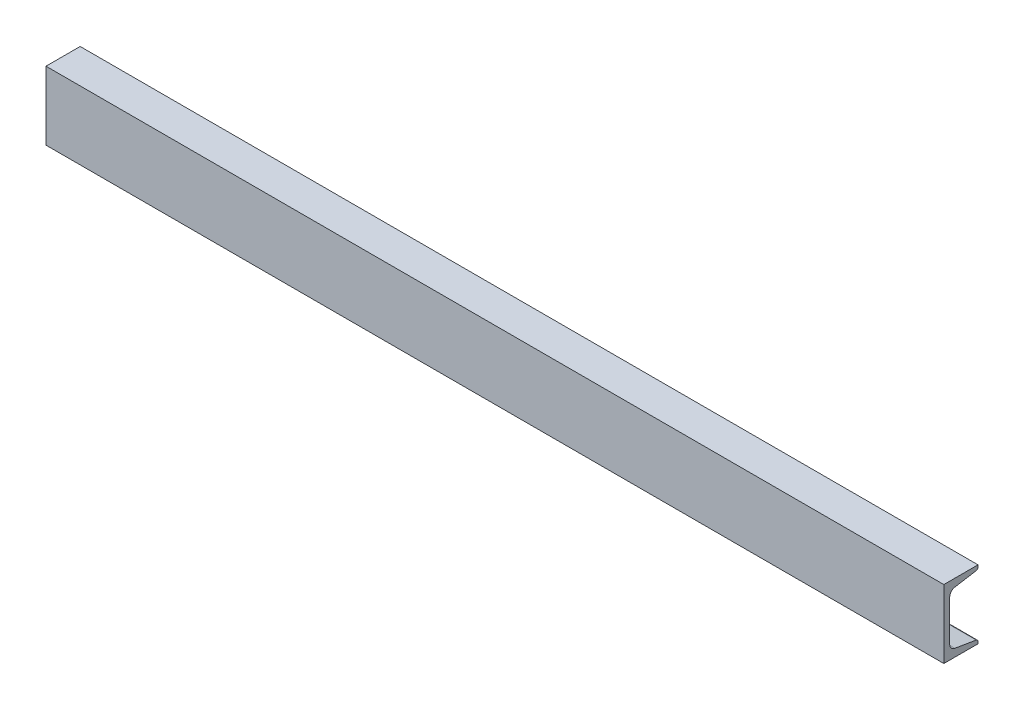
ISO-10303-21;
HEADER;
FILE_DESCRIPTION(('STEP AP214'),'2;1');
FILE_NAME('part.step','',(''),(''),'','','');
FILE_SCHEMA(('AUTOMOTIVE_DESIGN { 1 0 10303 214 1 1 1 1 }'));
ENDSEC;
DATA;
#1=APPLICATION_CONTEXT('core data for automotive mechanical design processes');
#2=APPLICATION_PROTOCOL_DEFINITION('international standard','automotive_design',2000,#1);
#3=PRODUCT_CONTEXT('',#1,'mechanical');
#4=PRODUCT('Part','Part','',(#3));
#5=PRODUCT_RELATED_PRODUCT_CATEGORY('part','',(#4));
#6=PRODUCT_DEFINITION_FORMATION('','',#4);
#7=PRODUCT_DEFINITION_CONTEXT('part definition',#1,'design');
#8=PRODUCT_DEFINITION('design','',#6,#7);
#9=PRODUCT_DEFINITION_SHAPE('','',#8);
#10=(LENGTH_UNIT() NAMED_UNIT(*) SI_UNIT(.MILLI.,.METRE.));
#11=(NAMED_UNIT(*) PLANE_ANGLE_UNIT() SI_UNIT($,.RADIAN.));
#12=(NAMED_UNIT(*) SI_UNIT($,.STERADIAN.) SOLID_ANGLE_UNIT());
#13=UNCERTAINTY_MEASURE_WITH_UNIT(LENGTH_MEASURE(1.E-05),#10,'distance_accuracy_value','');
#14=(GEOMETRIC_REPRESENTATION_CONTEXT(3) GLOBAL_UNCERTAINTY_ASSIGNED_CONTEXT((#13)) GLOBAL_UNIT_ASSIGNED_CONTEXT((#10,
#11,#12)) REPRESENTATION_CONTEXT('',''));
#15=CARTESIAN_POINT('',(0.,0.,0.));
#16=DIRECTION('',(0.,0.,1.));
#17=DIRECTION('',(1.,0.,0.));
#18=AXIS2_PLACEMENT_3D('',#15,#16,#17);
#19=CARTESIAN_POINT('',(1000.,-38.1,0.));
#20=DIRECTION('',(0.,1.,0.));
#21=DIRECTION('',(0.,0.,1.));
#22=AXIS2_PLACEMENT_3D('',#19,#20,#21);
#23=PLANE('',#22);
#24=DIRECTION('',(0.,0.,-1.));
#25=VECTOR('',#24,1.);
#26=CARTESIAN_POINT('',(0.,-38.1,0.));
#27=LINE('',#26,#25);
#28=CARTESIAN_POINT('',(0.,-38.1,0.));
#29=VERTEX_POINT('',#28);
#30=CARTESIAN_POINT('',(0.,-38.1,-38.0492));
#31=VERTEX_POINT('',#30);
#32=EDGE_CURVE('E198',#29,#31,#27,.T.);
#33=ORIENTED_EDGE('',*,*,#32,.T.);
#34=DIRECTION('',(-1.,0.,0.));
#35=VECTOR('',#34,1.);
#36=CARTESIAN_POINT('',(1000.,-38.1,-38.0492));
#37=LINE('',#36,#35);
#38=CARTESIAN_POINT('',(1000.,-38.1,-38.0492));
#39=VERTEX_POINT('',#38);
#40=EDGE_CURVE('E13',#39,#31,#37,.T.);
#41=ORIENTED_EDGE('',*,*,#40,.F.);
#42=DIRECTION('',(0.,0.,-1.));
#43=VECTOR('',#42,1.);
#44=CARTESIAN_POINT('',(1000.,-38.1,0.));
#45=LINE('',#44,#43);
#46=CARTESIAN_POINT('',(1000.,-38.1,0.));
#47=VERTEX_POINT('',#46);
#48=EDGE_CURVE('E220',#47,#39,#45,.T.);
#49=ORIENTED_EDGE('',*,*,#48,.F.);
#50=DIRECTION('',(-1.,0.,0.));
#51=VECTOR('',#50,1.);
#52=CARTESIAN_POINT('',(1000.,-38.1,0.));
#53=LINE('',#52,#51);
#54=EDGE_CURVE('E194',#47,#29,#53,.T.);
#55=ORIENTED_EDGE('',*,*,#54,.T.);
#56=EDGE_LOOP('',(#33,#41,#49,#55));
#57=FACE_BOUND('',#56,.T.);
#58=ADVANCED_FACE('F78',(#57),#23,.F.);
#59=CARTESIAN_POINT('',(1000.,-38.1,-38.0492));
#60=DIRECTION('',(0.,0.,1.));
#61=DIRECTION('',(1.,0.,0.));
#62=AXIS2_PLACEMENT_3D('',#59,#60,#61);
#63=PLANE('',#62);
#64=DIRECTION('',(0.,1.,0.));
#65=VECTOR('',#64,1.);
#66=CARTESIAN_POINT('',(0.,-38.1,-38.0492));
#67=LINE('',#66,#65);
#68=CARTESIAN_POINT('',(0.,-35.942335135838,-38.0492));
#69=VERTEX_POINT('',#68);
#70=EDGE_CURVE('E201',#31,#69,#67,.T.);
#71=ORIENTED_EDGE('',*,*,#70,.T.);
#72=DIRECTION('',(-1.,0.,0.));
#73=VECTOR('',#72,1.);
#74=CARTESIAN_POINT('',(1000.,-35.942335135838,-38.0492));
#75=LINE('',#74,#73);
#76=CARTESIAN_POINT('',(1000.,-35.942335135838,-38.0492));
#77=VERTEX_POINT('',#76);
#78=EDGE_CURVE('E86',#77,#69,#75,.T.);
#79=ORIENTED_EDGE('',*,*,#78,.F.);
#80=DIRECTION('',(0.,1.,0.));
#81=VECTOR('',#80,1.);
#82=CARTESIAN_POINT('',(1000.,-38.1,-38.0492));
#83=LINE('',#82,#81);
#84=EDGE_CURVE('E149',#39,#77,#83,.T.);
#85=ORIENTED_EDGE('',*,*,#84,.F.);
#86=ORIENTED_EDGE('',*,*,#40,.T.);
#87=EDGE_LOOP('',(#71,#79,#85,#86));
#88=FACE_BOUND('',#87,.T.);
#89=ADVANCED_FACE('F298',(#88),#63,.F.);
#90=CARTESIAN_POINT('',(1000.,-35.942335135838,-35.5092));
#91=DIRECTION('',(-1.,0.,0.));
#92=DIRECTION('',(0.,0.,1.));
#93=AXIS2_PLACEMENT_3D('',#90,#91,#92);
#94=CYLINDRICAL_SURFACE('',#93,2.54);
#95=CARTESIAN_POINT('',(0.,-35.942335135838,-35.5092));
#96=DIRECTION('',(1.,0.,0.));
#97=DIRECTION('',(0.,0.,-1.));
#98=AXIS2_PLACEMENT_3D('',#95,#96,#97);
#99=CIRCLE('',#98,2.54);
#100=CARTESIAN_POINT('',(0.,-33.4368995092487,-35.9268030663407));
#101=VERTEX_POINT('',#100);
#102=EDGE_CURVE('E203',#69,#101,#99,.T.);
#103=ORIENTED_EDGE('',*,*,#102,.T.);
#104=DIRECTION('',(-1.,0.,0.));
#105=VECTOR('',#104,1.);
#106=CARTESIAN_POINT('',(1000.,-33.4368995092487,-35.9268030663407));
#107=LINE('',#106,#105);
#108=CARTESIAN_POINT('',(1000.,-33.4368995092487,-35.9268030663407));
#109=VERTEX_POINT('',#108);
#110=EDGE_CURVE('E239',#109,#101,#107,.T.);
#111=ORIENTED_EDGE('',*,*,#110,.F.);
#112=CARTESIAN_POINT('',(1000.,-35.942335135838,-35.5092));
#113=DIRECTION('',(1.,0.,0.));
#114=DIRECTION('',(0.,0.,-1.));
#115=AXIS2_PLACEMENT_3D('',#112,#113,#114);
#116=CIRCLE('',#115,2.54);
#117=EDGE_CURVE('E247',#77,#109,#116,.T.);
#118=ORIENTED_EDGE('',*,*,#117,.F.);
#119=ORIENTED_EDGE('',*,*,#78,.T.);
#120=EDGE_LOOP('',(#103,#111,#118,#119));
#121=FACE_BOUND('',#120,.T.);
#122=ADVANCED_FACE('F245',(#121),#94,.T.);
#123=CARTESIAN_POINT('',(1000.,-29.4960901573836,-12.2836717208802));
#124=DIRECTION('',(0.,-0.986391978972162,0.164410656039629));
#125=DIRECTION('',(0.,-0.164410656039629,-0.986391978972162));
#126=AXIS2_PLACEMENT_3D('',#123,#124,#125);
#127=PLANE('',#126);
#128=DIRECTION('',(0.,0.164410656039629,0.986391978972162));
#129=VECTOR('',#128,1.);
#130=CARTESIAN_POINT('',(0.,-29.4960901573836,-12.2836717208802));
#131=LINE('',#130,#129);
#132=CARTESIAN_POINT('',(0.,-29.4960901573836,-12.2836717208802));
#133=VERTEX_POINT('',#132);
#134=EDGE_CURVE('E205',#101,#133,#131,.T.);
#135=ORIENTED_EDGE('',*,*,#134,.T.);
#136=DIRECTION('',(-1.,0.,0.));
#137=VECTOR('',#136,1.);
#138=CARTESIAN_POINT('',(1000.,-29.4960901573836,-12.2836717208802));
#139=LINE('',#138,#137);
#140=CARTESIAN_POINT('',(1000.,-29.4960901573836,-12.2836717208802));
#141=VERTEX_POINT('',#140);
#142=EDGE_CURVE('E236',#141,#133,#139,.T.);
#143=ORIENTED_EDGE('',*,*,#142,.F.);
#144=DIRECTION('',(0.,0.164410656039629,0.986391978972162));
#145=VECTOR('',#144,1.);
#146=CARTESIAN_POINT('',(1000.,-29.4960901573836,-12.2836717208802));
#147=LINE('',#146,#145);
#148=EDGE_CURVE('E265',#109,#141,#147,.T.);
#149=ORIENTED_EDGE('',*,*,#148,.F.);
#150=ORIENTED_EDGE('',*,*,#110,.T.);
#151=EDGE_LOOP('',(#135,#143,#149,#150));
#152=FACE_BOUND('',#151,.T.);
#153=ADVANCED_FACE('F256',(#152),#127,.F.);
#154=CARTESIAN_POINT('',(1000.,-22.7314139655925,-13.4112));
#155=DIRECTION('',(-1.,0.,0.));
#156=DIRECTION('',(0.,0.,1.));
#157=AXIS2_PLACEMENT_3D('',#154,#155,#156);
#158=CYLINDRICAL_SURFACE('',#157,6.85800000000001);
#159=CARTESIAN_POINT('',(0.,-22.7314139655925,-13.4112));
#160=DIRECTION('',(-1.,0.,0.));
#161=DIRECTION('',(0.,0.,-1.));
#162=AXIS2_PLACEMENT_3D('',#159,#160,#161);
#163=CIRCLE('',#162,6.85800000000001);
#164=CARTESIAN_POINT('',(0.,-22.7314139655925,-6.55320000000001));
#165=VERTEX_POINT('',#164);
#166=EDGE_CURVE('E207',#133,#165,#163,.T.);
#167=ORIENTED_EDGE('',*,*,#166,.T.);
#168=DIRECTION('',(-1.,0.,0.));
#169=VECTOR('',#168,1.);
#170=CARTESIAN_POINT('',(1000.,-22.7314139655925,-6.55320000000001));
#171=LINE('',#170,#169);
#172=CARTESIAN_POINT('',(1000.,-22.7314139655925,-6.55320000000001));
#173=VERTEX_POINT('',#172);
#174=EDGE_CURVE('E233',#173,#165,#171,.T.);
#175=ORIENTED_EDGE('',*,*,#174,.F.);
#176=CARTESIAN_POINT('',(1000.,-22.7314139655925,-13.4112));
#177=DIRECTION('',(-1.,0.,0.));
#178=DIRECTION('',(0.,0.,-1.));
#179=AXIS2_PLACEMENT_3D('',#176,#177,#178);
#180=CIRCLE('',#179,6.85800000000001);
#181=EDGE_CURVE('E262',#141,#173,#180,.T.);
#182=ORIENTED_EDGE('',*,*,#181,.F.);
#183=ORIENTED_EDGE('',*,*,#142,.T.);
#184=EDGE_LOOP('',(#167,#175,#182,#183));
#185=FACE_BOUND('',#184,.T.);
#186=ADVANCED_FACE('F260',(#185),#158,.F.);
#187=CARTESIAN_POINT('',(1000.,22.7314139655925,-6.55320000000001));
#188=DIRECTION('',(0.,0.,1.));
#189=DIRECTION('',(1.,0.,0.));
#190=AXIS2_PLACEMENT_3D('',#187,#188,#189);
#191=PLANE('',#190);
#192=DIRECTION('',(0.,1.,0.));
#193=VECTOR('',#192,1.);
#194=CARTESIAN_POINT('',(0.,22.7314139655925,-6.55320000000001));
#195=LINE('',#194,#193);
#196=CARTESIAN_POINT('',(0.,22.7314139655925,-6.5532));
#197=VERTEX_POINT('',#196);
#198=EDGE_CURVE('E209',#165,#197,#195,.T.);
#199=ORIENTED_EDGE('',*,*,#198,.T.);
#200=DIRECTION('',(-1.,0.,0.));
#201=VECTOR('',#200,1.);
#202=CARTESIAN_POINT('',(1000.,22.7314139655925,-6.5532));
#203=LINE('',#202,#201);
#204=CARTESIAN_POINT('',(1000.,22.7314139655925,-6.5532));
#205=VERTEX_POINT('',#204);
#206=EDGE_CURVE('E230',#205,#197,#203,.T.);
#207=ORIENTED_EDGE('',*,*,#206,.F.);
#208=DIRECTION('',(0.,1.,0.));
#209=VECTOR('',#208,1.);
#210=CARTESIAN_POINT('',(1000.,22.7314139655925,-6.55320000000001));
#211=LINE('',#210,#209);
#212=EDGE_CURVE('E264',#173,#205,#211,.T.);
#213=ORIENTED_EDGE('',*,*,#212,.F.);
#214=ORIENTED_EDGE('',*,*,#174,.T.);
#215=EDGE_LOOP('',(#199,#207,#213,#214));
#216=FACE_BOUND('',#215,.T.);
#217=ADVANCED_FACE('F311',(#216),#191,.F.);
#218=CARTESIAN_POINT('',(1000.,22.7314139655925,-13.4112));
#219=DIRECTION('',(-1.,0.,0.));
#220=DIRECTION('',(0.,0.,1.));
#221=AXIS2_PLACEMENT_3D('',#218,#219,#220);
#222=CYLINDRICAL_SURFACE('',#221,6.85800000000001);
#223=CARTESIAN_POINT('',(0.,22.7314139655925,-13.4112));
#224=DIRECTION('',(-1.,0.,0.));
#225=DIRECTION('',(0.,0.,1.));
#226=AXIS2_PLACEMENT_3D('',#223,#224,#225);
#227=CIRCLE('',#226,6.85800000000001);
#228=CARTESIAN_POINT('',(0.,29.4960901573836,-12.2836717208802));
#229=VERTEX_POINT('',#228);
#230=EDGE_CURVE('E211',#197,#229,#227,.T.);
#231=ORIENTED_EDGE('',*,*,#230,.T.);
#232=DIRECTION('',(-1.,0.,0.));
#233=VECTOR('',#232,1.);
#234=CARTESIAN_POINT('',(1000.,29.4960901573836,-12.2836717208802));
#235=LINE('',#234,#233);
#236=CARTESIAN_POINT('',(1000.,29.4960901573836,-12.2836717208802));
#237=VERTEX_POINT('',#236);
#238=EDGE_CURVE('E227',#237,#229,#235,.T.);
#239=ORIENTED_EDGE('',*,*,#238,.F.);
#240=CARTESIAN_POINT('',(1000.,22.7314139655925,-13.4112));
#241=DIRECTION('',(-1.,0.,0.));
#242=DIRECTION('',(0.,0.,1.));
#243=AXIS2_PLACEMENT_3D('',#240,#241,#242);
#244=CIRCLE('',#243,6.85800000000001);
#245=EDGE_CURVE('E267',#205,#237,#244,.T.);
#246=ORIENTED_EDGE('',*,*,#245,.F.);
#247=ORIENTED_EDGE('',*,*,#206,.T.);
#248=EDGE_LOOP('',(#231,#239,#246,#247));
#249=FACE_BOUND('',#248,.T.);
#250=ADVANCED_FACE('F314',(#249),#222,.F.);
#251=CARTESIAN_POINT('',(1000.,29.4960901573836,-12.2836717208802));
#252=DIRECTION('',(0.,0.986391978972162,0.164410656039629));
#253=DIRECTION('',(0.,-0.164410656039629,0.986391978972162));
#254=AXIS2_PLACEMENT_3D('',#251,#252,#253);
#255=PLANE('',#254);
#256=DIRECTION('',(0.,0.164410656039629,-0.986391978972162));
#257=VECTOR('',#256,1.);
#258=CARTESIAN_POINT('',(0.,29.4960901573836,-12.2836717208802));
#259=LINE('',#258,#257);
#260=CARTESIAN_POINT('',(0.,33.4368995092487,-35.9268030663407));
#261=VERTEX_POINT('',#260);
#262=EDGE_CURVE('E213',#229,#261,#259,.T.);
#263=ORIENTED_EDGE('',*,*,#262,.T.);
#264=DIRECTION('',(-1.,0.,0.));
#265=VECTOR('',#264,1.);
#266=CARTESIAN_POINT('',(1000.,33.4368995092487,-35.9268030663407));
#267=LINE('',#266,#265);
#268=CARTESIAN_POINT('',(1000.,33.4368995092487,-35.9268030663407));
#269=VERTEX_POINT('',#268);
#270=EDGE_CURVE('E224',#269,#261,#267,.T.);
#271=ORIENTED_EDGE('',*,*,#270,.F.);
#272=DIRECTION('',(0.,0.164410656039629,-0.986391978972162));
#273=VECTOR('',#272,1.);
#274=CARTESIAN_POINT('',(1000.,29.4960901573836,-12.2836717208802));
#275=LINE('',#274,#273);
#276=EDGE_CURVE('E273',#237,#269,#275,.T.);
#277=ORIENTED_EDGE('',*,*,#276,.F.);
#278=ORIENTED_EDGE('',*,*,#238,.T.);
#279=EDGE_LOOP('',(#263,#271,#277,#278));
#280=FACE_BOUND('',#279,.T.);
#281=ADVANCED_FACE('F279',(#280),#255,.F.);
#282=CARTESIAN_POINT('',(1000.,35.942335135838,-35.5092));
#283=DIRECTION('',(-1.,0.,0.));
#284=DIRECTION('',(0.,0.,1.));
#285=AXIS2_PLACEMENT_3D('',#282,#283,#284);
#286=CYLINDRICAL_SURFACE('',#285,2.54);
#287=CARTESIAN_POINT('',(0.,35.942335135838,-35.5092));
#288=DIRECTION('',(1.,0.,0.));
#289=DIRECTION('',(0.,0.,1.));
#290=AXIS2_PLACEMENT_3D('',#287,#288,#289);
#291=CIRCLE('',#290,2.54);
#292=CARTESIAN_POINT('',(0.,35.942335135838,-38.0492));
#293=VERTEX_POINT('',#292);
#294=EDGE_CURVE('E215',#261,#293,#291,.T.);
#295=ORIENTED_EDGE('',*,*,#294,.T.);
#296=DIRECTION('',(-1.,0.,0.));
#297=VECTOR('',#296,1.);
#298=CARTESIAN_POINT('',(1000.,35.942335135838,-38.0492));
#299=LINE('',#298,#297);
#300=CARTESIAN_POINT('',(1000.,35.942335135838,-38.0492));
#301=VERTEX_POINT('',#300);
#302=EDGE_CURVE('E189',#301,#293,#299,.T.);
#303=ORIENTED_EDGE('',*,*,#302,.F.);
#304=CARTESIAN_POINT('',(1000.,35.942335135838,-35.5092));
#305=DIRECTION('',(1.,0.,0.));
#306=DIRECTION('',(0.,0.,1.));
#307=AXIS2_PLACEMENT_3D('',#304,#305,#306);
#308=CIRCLE('',#307,2.54);
#309=EDGE_CURVE('E180',#269,#301,#308,.T.);
#310=ORIENTED_EDGE('',*,*,#309,.F.);
#311=ORIENTED_EDGE('',*,*,#270,.T.);
#312=EDGE_LOOP('',(#295,#303,#310,#311));
#313=FACE_BOUND('',#312,.T.);
#314=ADVANCED_FACE('F283',(#313),#286,.T.);
#315=CARTESIAN_POINT('',(1000.,38.1,-38.0492));
#316=DIRECTION('',(0.,0.,1.));
#317=DIRECTION('',(1.,0.,0.));
#318=AXIS2_PLACEMENT_3D('',#315,#316,#317);
#319=PLANE('',#318);
#320=DIRECTION('',(0.,1.,0.));
#321=VECTOR('',#320,1.);
#322=CARTESIAN_POINT('',(0.,38.1,-38.0492));
#323=LINE('',#322,#321);
#324=CARTESIAN_POINT('',(0.,38.1,-38.0492));
#325=VERTEX_POINT('',#324);
#326=EDGE_CURVE('E188',#293,#325,#323,.T.);
#327=ORIENTED_EDGE('',*,*,#326,.T.);
#328=DIRECTION('',(-1.,0.,0.));
#329=VECTOR('',#328,1.);
#330=CARTESIAN_POINT('',(1000.,38.1,-38.0492));
#331=LINE('',#330,#329);
#332=CARTESIAN_POINT('',(1000.,38.1,-38.0492));
#333=VERTEX_POINT('',#332);
#334=EDGE_CURVE('E185',#333,#325,#331,.T.);
#335=ORIENTED_EDGE('',*,*,#334,.F.);
#336=DIRECTION('',(0.,1.,0.));
#337=VECTOR('',#336,1.);
#338=CARTESIAN_POINT('',(1000.,38.1,-38.0492));
#339=LINE('',#338,#337);
#340=EDGE_CURVE('E174',#301,#333,#339,.T.);
#341=ORIENTED_EDGE('',*,*,#340,.F.);
#342=ORIENTED_EDGE('',*,*,#302,.T.);
#343=EDGE_LOOP('',(#327,#335,#341,#342));
#344=FACE_BOUND('',#343,.T.);
#345=ADVANCED_FACE('F186',(#344),#319,.F.);
#346=CARTESIAN_POINT('',(1000.,38.1,0.));
#347=DIRECTION('',(0.,-1.,0.));
#348=DIRECTION('',(0.,0.,-1.));
#349=AXIS2_PLACEMENT_3D('',#346,#347,#348);
#350=PLANE('',#349);
#351=DIRECTION('',(0.,0.,1.));
#352=VECTOR('',#351,1.);
#353=CARTESIAN_POINT('',(0.,38.1,0.));
#354=LINE('',#353,#352);
#355=CARTESIAN_POINT('',(0.,38.1,0.));
#356=VERTEX_POINT('',#355);
#357=EDGE_CURVE('E135',#325,#356,#354,.T.);
#358=ORIENTED_EDGE('',*,*,#357,.T.);
#359=DIRECTION('',(-1.,0.,0.));
#360=VECTOR('',#359,1.);
#361=CARTESIAN_POINT('',(1000.,38.1,0.));
#362=LINE('',#361,#360);
#363=CARTESIAN_POINT('',(1000.,38.1,0.));
#364=VERTEX_POINT('',#363);
#365=EDGE_CURVE('E190',#364,#356,#362,.T.);
#366=ORIENTED_EDGE('',*,*,#365,.F.);
#367=DIRECTION('',(0.,0.,1.));
#368=VECTOR('',#367,1.);
#369=CARTESIAN_POINT('',(1000.,38.1,0.));
#370=LINE('',#369,#368);
#371=EDGE_CURVE('E178',#333,#364,#370,.T.);
#372=ORIENTED_EDGE('',*,*,#371,.F.);
#373=ORIENTED_EDGE('',*,*,#334,.T.);
#374=EDGE_LOOP('',(#358,#366,#372,#373));
#375=FACE_BOUND('',#374,.T.);
#376=ADVANCED_FACE('F192',(#375),#350,.F.);
#377=CARTESIAN_POINT('',(1000.,-38.1,0.));
#378=DIRECTION('',(0.,0.,-1.));
#379=DIRECTION('',(-1.,0.,0.));
#380=AXIS2_PLACEMENT_3D('',#377,#378,#379);
#381=PLANE('',#380);
#382=DIRECTION('',(0.,-1.,0.));
#383=VECTOR('',#382,1.);
#384=CARTESIAN_POINT('',(0.,-38.1,0.));
#385=LINE('',#384,#383);
#386=EDGE_CURVE('E141',#356,#29,#385,.T.);
#387=ORIENTED_EDGE('',*,*,#386,.T.);
#388=ORIENTED_EDGE('',*,*,#54,.F.);
#389=DIRECTION('',(0.,-1.,0.));
#390=VECTOR('',#389,1.);
#391=CARTESIAN_POINT('',(1000.,-38.1,0.));
#392=LINE('',#391,#390);
#393=EDGE_CURVE('E94',#364,#47,#392,.T.);
#394=ORIENTED_EDGE('',*,*,#393,.F.);
#395=ORIENTED_EDGE('',*,*,#365,.T.);
#396=EDGE_LOOP('',(#387,#388,#394,#395));
#397=FACE_BOUND('',#396,.T.);
#398=ADVANCED_FACE('F287',(#397),#381,.F.);
#399=CARTESIAN_POINT('',(1000.,-35.942335135838,-35.5092));
#400=DIRECTION('',(1.,0.,0.));
#401=DIRECTION('',(0.,0.,-1.));
#402=AXIS2_PLACEMENT_3D('',#399,#400,#401);
#403=PLANE('',#402);
#404=ORIENTED_EDGE('',*,*,#48,.T.);
#405=ORIENTED_EDGE('',*,*,#84,.T.);
#406=ORIENTED_EDGE('',*,*,#117,.T.);
#407=ORIENTED_EDGE('',*,*,#148,.T.);
#408=ORIENTED_EDGE('',*,*,#181,.T.);
#409=ORIENTED_EDGE('',*,*,#212,.T.);
#410=ORIENTED_EDGE('',*,*,#245,.T.);
#411=ORIENTED_EDGE('',*,*,#276,.T.);
#412=ORIENTED_EDGE('',*,*,#309,.T.);
#413=ORIENTED_EDGE('',*,*,#340,.T.);
#414=ORIENTED_EDGE('',*,*,#371,.T.);
#415=ORIENTED_EDGE('',*,*,#393,.T.);
#416=EDGE_LOOP('',(#404,#405,#406,#407,#408,#409,#410,#411,#412,#413,#414,#415));
#417=FACE_BOUND('',#416,.T.);
#418=ADVANCED_FACE('F176',(#417),#403,.T.);
#419=CARTESIAN_POINT('',(0.,-35.942335135838,-35.5092));
#420=DIRECTION('',(1.,0.,0.));
#421=DIRECTION('',(0.,0.,-1.));
#422=AXIS2_PLACEMENT_3D('',#419,#420,#421);
#423=PLANE('',#422);
#424=ORIENTED_EDGE('',*,*,#32,.F.);
#425=ORIENTED_EDGE('',*,*,#386,.F.);
#426=ORIENTED_EDGE('',*,*,#357,.F.);
#427=ORIENTED_EDGE('',*,*,#326,.F.);
#428=ORIENTED_EDGE('',*,*,#294,.F.);
#429=ORIENTED_EDGE('',*,*,#262,.F.);
#430=ORIENTED_EDGE('',*,*,#230,.F.);
#431=ORIENTED_EDGE('',*,*,#198,.F.);
#432=ORIENTED_EDGE('',*,*,#166,.F.);
#433=ORIENTED_EDGE('',*,*,#134,.F.);
#434=ORIENTED_EDGE('',*,*,#102,.F.);
#435=ORIENTED_EDGE('',*,*,#70,.F.);
#436=EDGE_LOOP('',(#424,#425,#426,#427,#428,#429,#430,#431,#432,#433,#434,#435));
#437=FACE_BOUND('',#436,.T.);
#438=ADVANCED_FACE('F251',(#437),#423,.F.);
#439=CLOSED_SHELL('',(#58,#89,#122,#153,#186,#217,#250,#281,#314,#345,#376,#398,#418,#438));
#440=MANIFOLD_SOLID_BREP('B2',#439);
#441=ADVANCED_BREP_SHAPE_REPRESENTATION('',(#18,#440),#14);
#442=SHAPE_DEFINITION_REPRESENTATION(#9,#441);
ENDSEC;
END-ISO-10303-21;
